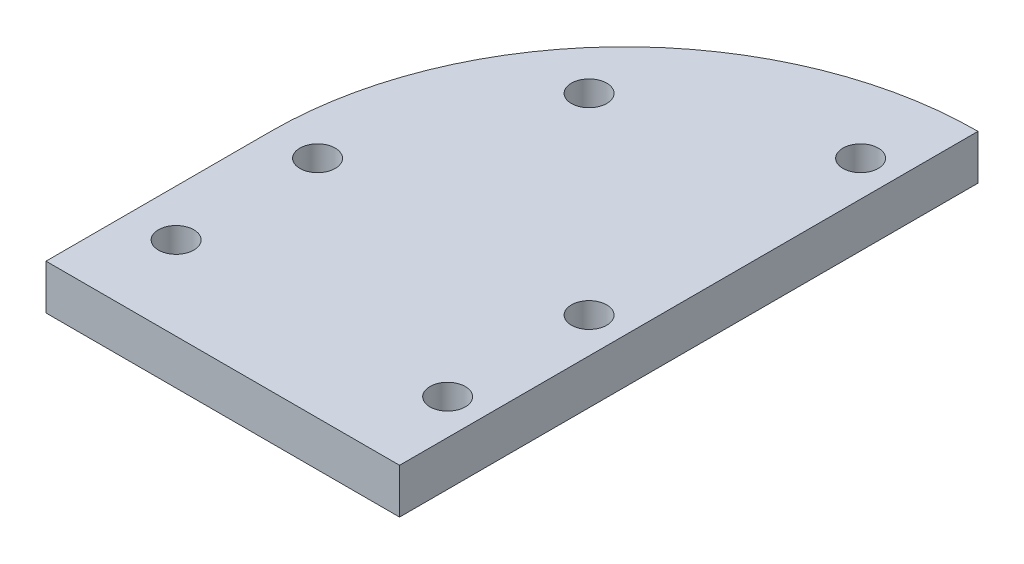
ISO-10303-21;
HEADER;
FILE_DESCRIPTION(('STEP AP214'),'2;1');
FILE_NAME('part.step','',(''),(''),'','','');
FILE_SCHEMA(('AUTOMOTIVE_DESIGN { 1 0 10303 214 1 1 1 1 }'));
ENDSEC;
DATA;
#1=APPLICATION_CONTEXT('core data for automotive mechanical design processes');
#2=APPLICATION_PROTOCOL_DEFINITION('international standard','automotive_design',2000,#1);
#3=PRODUCT_CONTEXT('',#1,'mechanical');
#4=PRODUCT('Part','Part','',(#3));
#5=PRODUCT_RELATED_PRODUCT_CATEGORY('part','',(#4));
#6=PRODUCT_DEFINITION_FORMATION('','',#4);
#7=PRODUCT_DEFINITION_CONTEXT('part definition',#1,'design');
#8=PRODUCT_DEFINITION('design','',#6,#7);
#9=PRODUCT_DEFINITION_SHAPE('','',#8);
#10=(LENGTH_UNIT() NAMED_UNIT(*) SI_UNIT(.MILLI.,.METRE.));
#11=(NAMED_UNIT(*) PLANE_ANGLE_UNIT() SI_UNIT($,.RADIAN.));
#12=(NAMED_UNIT(*) SI_UNIT($,.STERADIAN.) SOLID_ANGLE_UNIT());
#13=UNCERTAINTY_MEASURE_WITH_UNIT(LENGTH_MEASURE(1.E-05),#10,'distance_accuracy_value','');
#14=(GEOMETRIC_REPRESENTATION_CONTEXT(3) GLOBAL_UNCERTAINTY_ASSIGNED_CONTEXT((#13)) GLOBAL_UNIT_ASSIGNED_CONTEXT((#10,
#11,#12)) REPRESENTATION_CONTEXT('',''));
#15=CARTESIAN_POINT('',(0.,0.,0.));
#16=DIRECTION('',(0.,0.,1.));
#17=DIRECTION('',(1.,0.,0.));
#18=AXIS2_PLACEMENT_3D('',#15,#16,#17);
#19=CARTESIAN_POINT('',(50.,6.35,-31.8));
#20=DIRECTION('',(0.,-1.,0.));
#21=DIRECTION('',(0.,0.,-1.));
#22=AXIS2_PLACEMENT_3D('',#19,#20,#21);
#23=PLANE('',#22);
#24=DIRECTION('',(0.,0.,1.));
#25=VECTOR('',#24,1.);
#26=CARTESIAN_POINT('',(0.,6.35,0.));
#27=LINE('',#26,#25);
#28=CARTESIAN_POINT('',(0.,6.35,-31.8));
#29=VERTEX_POINT('',#28);
#30=CARTESIAN_POINT('',(0.,6.35,0.));
#31=VERTEX_POINT('',#30);
#32=EDGE_CURVE('E83',#29,#31,#27,.T.);
#33=ORIENTED_EDGE('',*,*,#32,.T.);
#34=DIRECTION('',(1.,0.,0.));
#35=VECTOR('',#34,1.);
#36=CARTESIAN_POINT('',(0.,6.35,0.));
#37=LINE('',#36,#35);
#38=CARTESIAN_POINT('',(50.,6.35,0.));
#39=VERTEX_POINT('',#38);
#40=EDGE_CURVE('E78',#31,#39,#37,.T.);
#41=ORIENTED_EDGE('',*,*,#40,.T.);
#42=DIRECTION('',(0.,0.,-1.));
#43=VECTOR('',#42,1.);
#44=CARTESIAN_POINT('',(50.,6.35,0.));
#45=LINE('',#44,#43);
#46=CARTESIAN_POINT('',(50.,6.35,-81.8));
#47=VERTEX_POINT('',#46);
#48=EDGE_CURVE('E81',#39,#47,#45,.T.);
#49=ORIENTED_EDGE('',*,*,#48,.T.);
#50=CARTESIAN_POINT('',(50.,6.35,-31.8));
#51=DIRECTION('',(0.,1.,0.));
#52=DIRECTION('',(0.,0.,-1.));
#53=AXIS2_PLACEMENT_3D('',#50,#51,#52);
#54=CIRCLE('',#53,50.);
#55=EDGE_CURVE('E49',#47,#29,#54,.T.);
#56=ORIENTED_EDGE('',*,*,#55,.T.);
#57=EDGE_LOOP('',(#33,#41,#49,#56));
#58=FACE_BOUND('',#57,.T.);
#59=CARTESIAN_POINT('',(45.,6.35,-31.8));
#60=DIRECTION('',(0.,1.,0.));
#61=DIRECTION('',(0.,0.,1.));
#62=AXIS2_PLACEMENT_3D('',#59,#60,#61);
#63=CIRCLE('',#62,2.5);
#64=CARTESIAN_POINT('',(45.,6.35,-29.3));
#65=VERTEX_POINT('',#64);
#66=EDGE_CURVE('E99',#65,#65,#63,.T.);
#67=ORIENTED_EDGE('',*,*,#66,.F.);
#68=EDGE_LOOP('',(#67));
#69=FACE_BOUND('',#68,.T.);
#70=CARTESIAN_POINT('',(6.60000000000001,6.35,-31.8));
#71=DIRECTION('',(0.,1.,0.));
#72=DIRECTION('',(0.,0.,1.));
#73=AXIS2_PLACEMENT_3D('',#70,#71,#72);
#74=CIRCLE('',#73,2.5);
#75=CARTESIAN_POINT('',(6.60000000000001,6.35,-29.3));
#76=VERTEX_POINT('',#75);
#77=EDGE_CURVE('E114',#76,#76,#74,.T.);
#78=ORIENTED_EDGE('',*,*,#77,.F.);
#79=EDGE_LOOP('',(#78));
#80=FACE_BOUND('',#79,.T.);
#81=CARTESIAN_POINT('',(17.8470996024366,6.35,-58.9529003975635));
#82=DIRECTION('',(0.,1.,0.));
#83=DIRECTION('',(0.,0.,1.));
#84=AXIS2_PLACEMENT_3D('',#81,#82,#83);
#85=CIRCLE('',#84,2.50000000000002);
#86=CARTESIAN_POINT('',(17.8470996024366,6.35,-56.4529003975634));
#87=VERTEX_POINT('',#86);
#88=EDGE_CURVE('E120',#87,#87,#85,.T.);
#89=ORIENTED_EDGE('',*,*,#88,.F.);
#90=EDGE_LOOP('',(#89));
#91=FACE_BOUND('',#90,.T.);
#92=CARTESIAN_POINT('',(45.,6.35,-70.2));
#93=DIRECTION('',(0.,1.,0.));
#94=DIRECTION('',(0.,0.,1.));
#95=AXIS2_PLACEMENT_3D('',#92,#93,#94);
#96=CIRCLE('',#95,2.5);
#97=CARTESIAN_POINT('',(45.,6.35,-67.7));
#98=VERTEX_POINT('',#97);
#99=EDGE_CURVE('E126',#98,#98,#96,.T.);
#100=ORIENTED_EDGE('',*,*,#99,.F.);
#101=EDGE_LOOP('',(#100));
#102=FACE_BOUND('',#101,.T.);
#103=CARTESIAN_POINT('',(6.60000000000001,6.35,-11.8));
#104=DIRECTION('',(0.,1.,0.));
#105=DIRECTION('',(0.,0.,1.));
#106=AXIS2_PLACEMENT_3D('',#103,#104,#105);
#107=CIRCLE('',#106,2.5);
#108=CARTESIAN_POINT('',(6.60000000000001,6.35,-9.3));
#109=VERTEX_POINT('',#108);
#110=EDGE_CURVE('E132',#109,#109,#107,.T.);
#111=ORIENTED_EDGE('',*,*,#110,.F.);
#112=EDGE_LOOP('',(#111));
#113=FACE_BOUND('',#112,.T.);
#114=CARTESIAN_POINT('',(45.,6.35,-11.8));
#115=DIRECTION('',(0.,1.,0.));
#116=DIRECTION('',(0.,0.,1.));
#117=AXIS2_PLACEMENT_3D('',#114,#115,#116);
#118=CIRCLE('',#117,2.5);
#119=CARTESIAN_POINT('',(45.,6.35,-9.3));
#120=VERTEX_POINT('',#119);
#121=EDGE_CURVE('E138',#120,#120,#118,.T.);
#122=ORIENTED_EDGE('',*,*,#121,.F.);
#123=EDGE_LOOP('',(#122));
#124=FACE_BOUND('',#123,.T.);
#125=ADVANCED_FACE('F32',(#58,#69,#80,#91,#102,#113,#124),#23,.F.);
#126=CARTESIAN_POINT('',(50.,0.,-31.8));
#127=DIRECTION('',(0.,-1.,0.));
#128=DIRECTION('',(0.,0.,-1.));
#129=AXIS2_PLACEMENT_3D('',#126,#127,#128);
#130=PLANE('',#129);
#131=CARTESIAN_POINT('',(6.60000000000001,0.,-11.8));
#132=DIRECTION('',(0.,1.,0.));
#133=DIRECTION('',(0.,0.,1.));
#134=AXIS2_PLACEMENT_3D('',#131,#132,#133);
#135=CIRCLE('',#134,2.5);
#136=CARTESIAN_POINT('',(6.60000000000001,0.,-9.3));
#137=VERTEX_POINT('',#136);
#138=EDGE_CURVE('E135',#137,#137,#135,.T.);
#139=ORIENTED_EDGE('',*,*,#138,.T.);
#140=EDGE_LOOP('',(#139));
#141=FACE_BOUND('',#140,.T.);
#142=CARTESIAN_POINT('',(17.8470996024366,0.,-58.9529003975635));
#143=DIRECTION('',(0.,1.,0.));
#144=DIRECTION('',(0.,0.,1.));
#145=AXIS2_PLACEMENT_3D('',#142,#143,#144);
#146=CIRCLE('',#145,2.50000000000002);
#147=CARTESIAN_POINT('',(17.8470996024366,0.,-56.4529003975634));
#148=VERTEX_POINT('',#147);
#149=EDGE_CURVE('E123',#148,#148,#146,.T.);
#150=ORIENTED_EDGE('',*,*,#149,.T.);
#151=EDGE_LOOP('',(#150));
#152=FACE_BOUND('',#151,.T.);
#153=CARTESIAN_POINT('',(45.,0.,-31.8));
#154=DIRECTION('',(0.,1.,0.));
#155=DIRECTION('',(0.,0.,1.));
#156=AXIS2_PLACEMENT_3D('',#153,#154,#155);
#157=CIRCLE('',#156,2.5);
#158=CARTESIAN_POINT('',(45.,0.,-29.3));
#159=VERTEX_POINT('',#158);
#160=EDGE_CURVE('E111',#159,#159,#157,.T.);
#161=ORIENTED_EDGE('',*,*,#160,.T.);
#162=EDGE_LOOP('',(#161));
#163=FACE_BOUND('',#162,.T.);
#164=DIRECTION('',(0.,0.,1.));
#165=VECTOR('',#164,1.);
#166=CARTESIAN_POINT('',(0.,0.,0.));
#167=LINE('',#166,#165);
#168=CARTESIAN_POINT('',(0.,0.,-31.8));
#169=VERTEX_POINT('',#168);
#170=CARTESIAN_POINT('',(0.,0.,0.));
#171=VERTEX_POINT('',#170);
#172=EDGE_CURVE('E96',#169,#171,#167,.T.);
#173=ORIENTED_EDGE('',*,*,#172,.F.);
#174=CARTESIAN_POINT('',(50.,0.,-31.8));
#175=DIRECTION('',(0.,1.,0.));
#176=DIRECTION('',(0.,0.,-1.));
#177=AXIS2_PLACEMENT_3D('',#174,#175,#176);
#178=CIRCLE('',#177,50.);
#179=CARTESIAN_POINT('',(50.,0.,-81.8));
#180=VERTEX_POINT('',#179);
#181=EDGE_CURVE('E71',#180,#169,#178,.T.);
#182=ORIENTED_EDGE('',*,*,#181,.F.);
#183=DIRECTION('',(0.,0.,-1.));
#184=VECTOR('',#183,1.);
#185=CARTESIAN_POINT('',(50.,0.,-31.8));
#186=LINE('',#185,#184);
#187=CARTESIAN_POINT('',(50.,0.,0.));
#188=VERTEX_POINT('',#187);
#189=EDGE_CURVE('E65',#188,#180,#186,.T.);
#190=ORIENTED_EDGE('',*,*,#189,.F.);
#191=DIRECTION('',(1.,0.,0.));
#192=VECTOR('',#191,1.);
#193=CARTESIAN_POINT('',(0.,0.,0.));
#194=LINE('',#193,#192);
#195=EDGE_CURVE('E88',#171,#188,#194,.T.);
#196=ORIENTED_EDGE('',*,*,#195,.F.);
#197=EDGE_LOOP('',(#173,#182,#190,#196));
#198=FACE_BOUND('',#197,.T.);
#199=CARTESIAN_POINT('',(6.60000000000001,0.,-31.8));
#200=DIRECTION('',(0.,1.,0.));
#201=DIRECTION('',(0.,0.,1.));
#202=AXIS2_PLACEMENT_3D('',#199,#200,#201);
#203=CIRCLE('',#202,2.5);
#204=CARTESIAN_POINT('',(6.60000000000001,0.,-29.3));
#205=VERTEX_POINT('',#204);
#206=EDGE_CURVE('E117',#205,#205,#203,.T.);
#207=ORIENTED_EDGE('',*,*,#206,.T.);
#208=EDGE_LOOP('',(#207));
#209=FACE_BOUND('',#208,.T.);
#210=CARTESIAN_POINT('',(45.,0.,-70.2));
#211=DIRECTION('',(0.,1.,0.));
#212=DIRECTION('',(0.,0.,1.));
#213=AXIS2_PLACEMENT_3D('',#210,#211,#212);
#214=CIRCLE('',#213,2.5);
#215=CARTESIAN_POINT('',(45.,0.,-67.7));
#216=VERTEX_POINT('',#215);
#217=EDGE_CURVE('E129',#216,#216,#214,.T.);
#218=ORIENTED_EDGE('',*,*,#217,.T.);
#219=EDGE_LOOP('',(#218));
#220=FACE_BOUND('',#219,.T.);
#221=CARTESIAN_POINT('',(45.,0.,-11.8));
#222=DIRECTION('',(0.,1.,0.));
#223=DIRECTION('',(0.,0.,1.));
#224=AXIS2_PLACEMENT_3D('',#221,#222,#223);
#225=CIRCLE('',#224,2.5);
#226=CARTESIAN_POINT('',(45.,0.,-9.3));
#227=VERTEX_POINT('',#226);
#228=EDGE_CURVE('E141',#227,#227,#225,.T.);
#229=ORIENTED_EDGE('',*,*,#228,.T.);
#230=EDGE_LOOP('',(#229));
#231=FACE_BOUND('',#230,.T.);
#232=ADVANCED_FACE('F107',(#141,#152,#163,#198,#209,#220,#231),#130,.T.);
#233=CARTESIAN_POINT('',(0.,6.35,0.));
#234=DIRECTION('',(1.,0.,0.));
#235=DIRECTION('',(0.,0.,-1.));
#236=AXIS2_PLACEMENT_3D('',#233,#234,#235);
#237=PLANE('',#236);
#238=ORIENTED_EDGE('',*,*,#172,.T.);
#239=DIRECTION('',(0.,-1.,0.));
#240=VECTOR('',#239,1.);
#241=CARTESIAN_POINT('',(0.,6.35,0.));
#242=LINE('',#241,#240);
#243=EDGE_CURVE('E11',#31,#171,#242,.T.);
#244=ORIENTED_EDGE('',*,*,#243,.F.);
#245=ORIENTED_EDGE('',*,*,#32,.F.);
#246=DIRECTION('',(0.,-1.,0.));
#247=VECTOR('',#246,1.);
#248=CARTESIAN_POINT('',(0.,6.35,-31.8));
#249=LINE('',#248,#247);
#250=EDGE_CURVE('E92',#29,#169,#249,.T.);
#251=ORIENTED_EDGE('',*,*,#250,.T.);
#252=EDGE_LOOP('',(#238,#244,#245,#251));
#253=FACE_BOUND('',#252,.T.);
#254=ADVANCED_FACE('F34',(#253),#237,.F.);
#255=CARTESIAN_POINT('',(0.,6.35,0.));
#256=DIRECTION('',(0.,0.,-1.));
#257=DIRECTION('',(-1.,0.,0.));
#258=AXIS2_PLACEMENT_3D('',#255,#256,#257);
#259=PLANE('',#258);
#260=ORIENTED_EDGE('',*,*,#195,.T.);
#261=DIRECTION('',(0.,-1.,0.));
#262=VECTOR('',#261,1.);
#263=CARTESIAN_POINT('',(50.,6.35,0.));
#264=LINE('',#263,#262);
#265=EDGE_CURVE('E41',#39,#188,#264,.T.);
#266=ORIENTED_EDGE('',*,*,#265,.F.);
#267=ORIENTED_EDGE('',*,*,#40,.F.);
#268=ORIENTED_EDGE('',*,*,#243,.T.);
#269=EDGE_LOOP('',(#260,#266,#267,#268));
#270=FACE_BOUND('',#269,.T.);
#271=ADVANCED_FACE('F87',(#270),#259,.F.);
#272=CARTESIAN_POINT('',(50.,6.35,-31.8));
#273=DIRECTION('',(-1.,0.,0.));
#274=DIRECTION('',(0.,0.,1.));
#275=AXIS2_PLACEMENT_3D('',#272,#273,#274);
#276=PLANE('',#275);
#277=ORIENTED_EDGE('',*,*,#189,.T.);
#278=DIRECTION('',(0.,-1.,0.));
#279=VECTOR('',#278,1.);
#280=CARTESIAN_POINT('',(50.,6.35,-81.8));
#281=LINE('',#280,#279);
#282=EDGE_CURVE('E89',#47,#180,#281,.T.);
#283=ORIENTED_EDGE('',*,*,#282,.F.);
#284=ORIENTED_EDGE('',*,*,#48,.F.);
#285=ORIENTED_EDGE('',*,*,#265,.T.);
#286=EDGE_LOOP('',(#277,#283,#284,#285));
#287=FACE_BOUND('',#286,.T.);
#288=ADVANCED_FACE('F90',(#287),#276,.F.);
#289=CARTESIAN_POINT('',(50.,6.35,-31.8));
#290=DIRECTION('',(0.,-1.,0.));
#291=DIRECTION('',(0.,0.,-1.));
#292=AXIS2_PLACEMENT_3D('',#289,#290,#291);
#293=CYLINDRICAL_SURFACE('',#292,50.);
#294=ORIENTED_EDGE('',*,*,#181,.T.);
#295=ORIENTED_EDGE('',*,*,#250,.F.);
#296=ORIENTED_EDGE('',*,*,#55,.F.);
#297=ORIENTED_EDGE('',*,*,#282,.T.);
#298=EDGE_LOOP('',(#294,#295,#296,#297));
#299=FACE_BOUND('',#298,.T.);
#300=ADVANCED_FACE('F104',(#299),#293,.T.);
#301=CARTESIAN_POINT('',(45.,6.35,-31.8));
#302=DIRECTION('',(0.,-1.,0.));
#303=DIRECTION('',(0.,0.,-1.));
#304=AXIS2_PLACEMENT_3D('',#301,#302,#303);
#305=CYLINDRICAL_SURFACE('',#304,2.5);
#306=ORIENTED_EDGE('',*,*,#66,.T.);
#307=EDGE_LOOP('',(#306));
#308=FACE_BOUND('',#307,.T.);
#309=ORIENTED_EDGE('',*,*,#160,.F.);
#310=EDGE_LOOP('',(#309));
#311=FACE_BOUND('',#310,.T.);
#312=ADVANCED_FACE('F158',(#308,#311),#305,.F.);
#313=CARTESIAN_POINT('',(6.60000000000001,6.35,-31.8));
#314=DIRECTION('',(0.,-1.,0.));
#315=DIRECTION('',(0.,0.,-1.));
#316=AXIS2_PLACEMENT_3D('',#313,#314,#315);
#317=CYLINDRICAL_SURFACE('',#316,2.5);
#318=ORIENTED_EDGE('',*,*,#77,.T.);
#319=EDGE_LOOP('',(#318));
#320=FACE_BOUND('',#319,.T.);
#321=ORIENTED_EDGE('',*,*,#206,.F.);
#322=EDGE_LOOP('',(#321));
#323=FACE_BOUND('',#322,.T.);
#324=ADVANCED_FACE('F207',(#320,#323),#317,.F.);
#325=CARTESIAN_POINT('',(17.8470996024366,6.35,-58.9529003975635));
#326=DIRECTION('',(0.,-1.,0.));
#327=DIRECTION('',(0.,0.,-1.));
#328=AXIS2_PLACEMENT_3D('',#325,#326,#327);
#329=CYLINDRICAL_SURFACE('',#328,2.50000000000002);
#330=ORIENTED_EDGE('',*,*,#88,.T.);
#331=EDGE_LOOP('',(#330));
#332=FACE_BOUND('',#331,.T.);
#333=ORIENTED_EDGE('',*,*,#149,.F.);
#334=EDGE_LOOP('',(#333));
#335=FACE_BOUND('',#334,.T.);
#336=ADVANCED_FACE('F215',(#332,#335),#329,.F.);
#337=CARTESIAN_POINT('',(45.,6.35,-70.2));
#338=DIRECTION('',(0.,-1.,0.));
#339=DIRECTION('',(0.,0.,-1.));
#340=AXIS2_PLACEMENT_3D('',#337,#338,#339);
#341=CYLINDRICAL_SURFACE('',#340,2.5);
#342=ORIENTED_EDGE('',*,*,#99,.T.);
#343=EDGE_LOOP('',(#342));
#344=FACE_BOUND('',#343,.T.);
#345=ORIENTED_EDGE('',*,*,#217,.F.);
#346=EDGE_LOOP('',(#345));
#347=FACE_BOUND('',#346,.T.);
#348=ADVANCED_FACE('F223',(#344,#347),#341,.F.);
#349=CARTESIAN_POINT('',(6.60000000000001,6.35,-11.8));
#350=DIRECTION('',(0.,-1.,0.));
#351=DIRECTION('',(0.,0.,-1.));
#352=AXIS2_PLACEMENT_3D('',#349,#350,#351);
#353=CYLINDRICAL_SURFACE('',#352,2.5);
#354=ORIENTED_EDGE('',*,*,#110,.T.);
#355=EDGE_LOOP('',(#354));
#356=FACE_BOUND('',#355,.T.);
#357=ORIENTED_EDGE('',*,*,#138,.F.);
#358=EDGE_LOOP('',(#357));
#359=FACE_BOUND('',#358,.T.);
#360=ADVANCED_FACE('F232',(#356,#359),#353,.F.);
#361=CARTESIAN_POINT('',(45.,6.35,-11.8));
#362=DIRECTION('',(0.,-1.,0.));
#363=DIRECTION('',(0.,0.,-1.));
#364=AXIS2_PLACEMENT_3D('',#361,#362,#363);
#365=CYLINDRICAL_SURFACE('',#364,2.5);
#366=ORIENTED_EDGE('',*,*,#121,.T.);
#367=EDGE_LOOP('',(#366));
#368=FACE_BOUND('',#367,.T.);
#369=ORIENTED_EDGE('',*,*,#228,.F.);
#370=EDGE_LOOP('',(#369));
#371=FACE_BOUND('',#370,.T.);
#372=ADVANCED_FACE('F147',(#368,#371),#365,.F.);
#373=CLOSED_SHELL('',(#125,#232,#254,#271,#288,#300,#312,#324,#336,#348,#360,#372));
#374=MANIFOLD_SOLID_BREP('B2',#373);
#375=ADVANCED_BREP_SHAPE_REPRESENTATION('',(#18,#374),#14);
#376=SHAPE_DEFINITION_REPRESENTATION(#9,#375);
ENDSEC;
END-ISO-10303-21;
